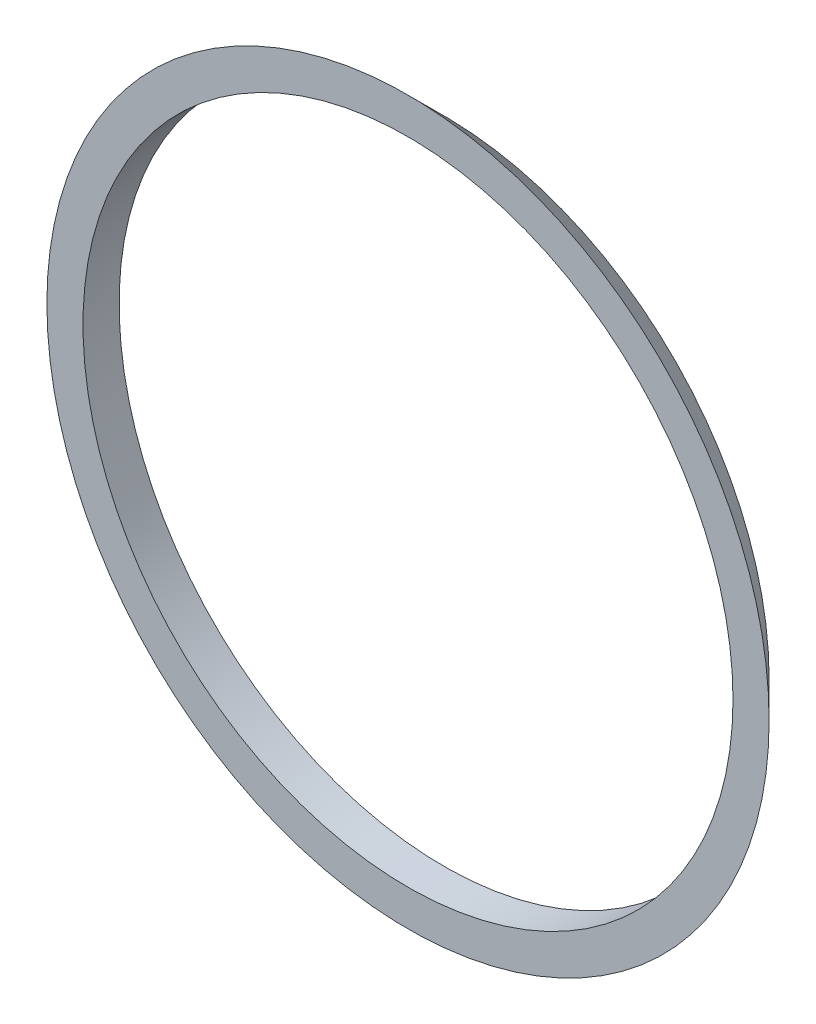
ISO-10303-21;
HEADER;
FILE_DESCRIPTION(('STEP AP214'),'2;1');
FILE_NAME('part.step','',(''),(''),'','','');
FILE_SCHEMA(('AUTOMOTIVE_DESIGN { 1 0 10303 214 1 1 1 1 }'));
ENDSEC;
DATA;
#1=APPLICATION_CONTEXT('core data for automotive mechanical design processes');
#2=APPLICATION_PROTOCOL_DEFINITION('international standard','automotive_design',2000,#1);
#3=PRODUCT_CONTEXT('',#1,'mechanical');
#4=PRODUCT('Part','Part','',(#3));
#5=PRODUCT_RELATED_PRODUCT_CATEGORY('part','',(#4));
#6=PRODUCT_DEFINITION_FORMATION('','',#4);
#7=PRODUCT_DEFINITION_CONTEXT('part definition',#1,'design');
#8=PRODUCT_DEFINITION('design','',#6,#7);
#9=PRODUCT_DEFINITION_SHAPE('','',#8);
#10=(LENGTH_UNIT() NAMED_UNIT(*) SI_UNIT(.MILLI.,.METRE.));
#11=(NAMED_UNIT(*) PLANE_ANGLE_UNIT() SI_UNIT($,.RADIAN.));
#12=(NAMED_UNIT(*) SI_UNIT($,.STERADIAN.) SOLID_ANGLE_UNIT());
#13=UNCERTAINTY_MEASURE_WITH_UNIT(LENGTH_MEASURE(1.E-05),#10,'distance_accuracy_value','');
#14=(GEOMETRIC_REPRESENTATION_CONTEXT(3) GLOBAL_UNCERTAINTY_ASSIGNED_CONTEXT((#13)) GLOBAL_UNIT_ASSIGNED_CONTEXT((#10,
#11,#12)) REPRESENTATION_CONTEXT('',''));
#15=CARTESIAN_POINT('',(0.,0.,0.));
#16=DIRECTION('',(0.,0.,1.));
#17=DIRECTION('',(1.,0.,0.));
#18=AXIS2_PLACEMENT_3D('',#15,#16,#17);
#19=CARTESIAN_POINT('',(0.,0.,0.));
#20=DIRECTION('',(0.,0.,1.));
#21=DIRECTION('',(1.,0.,0.));
#22=AXIS2_PLACEMENT_3D('',#19,#20,#21);
#23=CYLINDRICAL_SURFACE('',#22,18.);
#24=CARTESIAN_POINT('',(0.,0.,-2.));
#25=DIRECTION('',(0.,0.,1.));
#26=DIRECTION('',(1.,0.,0.));
#27=AXIS2_PLACEMENT_3D('',#24,#25,#26);
#28=CIRCLE('',#27,18.);
#29=CARTESIAN_POINT('',(18.,0.,-2.));
#30=VERTEX_POINT('',#29);
#31=EDGE_CURVE('E49',#30,#30,#28,.T.);
#32=ORIENTED_EDGE('',*,*,#31,.F.);
#33=EDGE_LOOP('',(#32));
#34=FACE_BOUND('',#33,.T.);
#35=CARTESIAN_POINT('',(0.,0.,0.));
#36=DIRECTION('',(0.,0.,1.));
#37=DIRECTION('',(1.,0.,0.));
#38=AXIS2_PLACEMENT_3D('',#35,#36,#37);
#39=CIRCLE('',#38,18.);
#40=CARTESIAN_POINT('',(18.,0.,0.));
#41=VERTEX_POINT('',#40);
#42=EDGE_CURVE('E10',#41,#41,#39,.T.);
#43=ORIENTED_EDGE('',*,*,#42,.T.);
#44=EDGE_LOOP('',(#43));
#45=FACE_BOUND('',#44,.T.);
#46=ADVANCED_FACE('F36',(#34,#45),#23,.F.);
#47=CARTESIAN_POINT('',(0.,18.,0.));
#48=DIRECTION('',(0.,0.,-1.));
#49=DIRECTION('',(-1.,0.,0.));
#50=AXIS2_PLACEMENT_3D('',#47,#48,#49);
#51=PLANE('',#50);
#52=ORIENTED_EDGE('',*,*,#42,.F.);
#53=EDGE_LOOP('',(#52));
#54=FACE_BOUND('',#53,.T.);
#55=CARTESIAN_POINT('',(0.,0.,0.));
#56=DIRECTION('',(0.,0.,1.));
#57=DIRECTION('',(1.,0.,0.));
#58=AXIS2_PLACEMENT_3D('',#55,#56,#57);
#59=CIRCLE('',#58,20.);
#60=CARTESIAN_POINT('',(20.,0.,0.));
#61=VERTEX_POINT('',#60);
#62=EDGE_CURVE('E43',#61,#61,#59,.T.);
#63=ORIENTED_EDGE('',*,*,#62,.T.);
#64=EDGE_LOOP('',(#63));
#65=FACE_BOUND('',#64,.T.);
#66=ADVANCED_FACE('F59',(#54,#65),#51,.F.);
#67=CARTESIAN_POINT('',(0.,0.,-2.));
#68=DIRECTION('',(0.,0.,1.));
#69=DIRECTION('',(1.,0.,0.));
#70=AXIS2_PLACEMENT_3D('',#67,#68,#69);
#71=CONICAL_SURFACE('',#70,18.,0.785398163397448);
#72=ORIENTED_EDGE('',*,*,#62,.F.);
#73=EDGE_LOOP('',(#72));
#74=FACE_BOUND('',#73,.T.);
#75=ORIENTED_EDGE('',*,*,#31,.T.);
#76=EDGE_LOOP('',(#75));
#77=FACE_BOUND('',#76,.T.);
#78=ADVANCED_FACE('F56',(#74,#77),#71,.T.);
#79=CLOSED_SHELL('',(#46,#66,#78));
#80=MANIFOLD_SOLID_BREP('B2',#79);
#81=ADVANCED_BREP_SHAPE_REPRESENTATION('',(#18,#80),#14);
#82=SHAPE_DEFINITION_REPRESENTATION(#9,#81);
ENDSEC;
END-ISO-10303-21;
